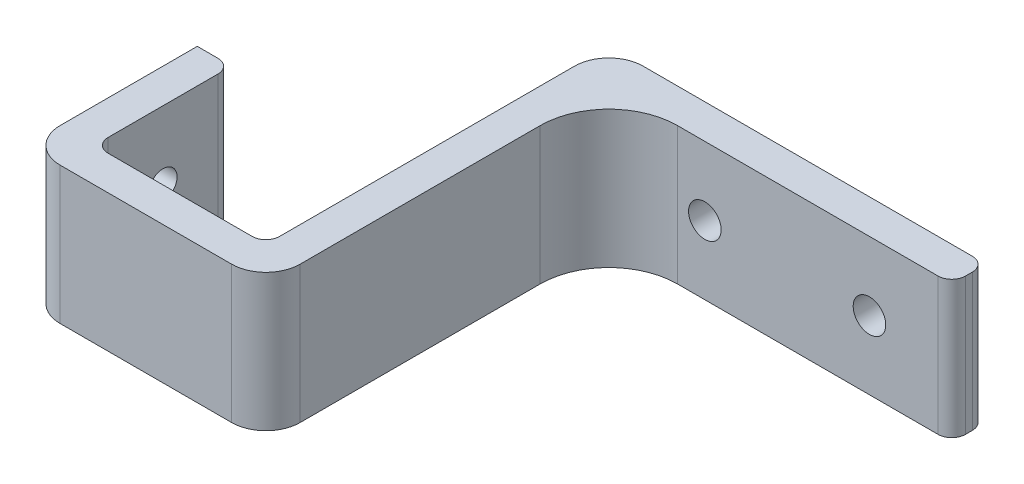
ISO-10303-21;
HEADER;
FILE_DESCRIPTION(('STEP AP214'),'2;1');
FILE_NAME('part.step','',(''),(''),'','','');
FILE_SCHEMA(('AUTOMOTIVE_DESIGN { 1 0 10303 214 1 1 1 1 }'));
ENDSEC;
DATA;
#1=APPLICATION_CONTEXT('core data for automotive mechanical design processes');
#2=APPLICATION_PROTOCOL_DEFINITION('international standard','automotive_design',2000,#1);
#3=PRODUCT_CONTEXT('',#1,'mechanical');
#4=PRODUCT('Part','Part','',(#3));
#5=PRODUCT_RELATED_PRODUCT_CATEGORY('part','',(#4));
#6=PRODUCT_DEFINITION_FORMATION('','',#4);
#7=PRODUCT_DEFINITION_CONTEXT('part definition',#1,'design');
#8=PRODUCT_DEFINITION('design','',#6,#7);
#9=PRODUCT_DEFINITION_SHAPE('','',#8);
#10=(LENGTH_UNIT() NAMED_UNIT(*) SI_UNIT(.MILLI.,.METRE.));
#11=(NAMED_UNIT(*) PLANE_ANGLE_UNIT() SI_UNIT($,.RADIAN.));
#12=(NAMED_UNIT(*) SI_UNIT($,.STERADIAN.) SOLID_ANGLE_UNIT());
#13=UNCERTAINTY_MEASURE_WITH_UNIT(LENGTH_MEASURE(1.E-05),#10,'distance_accuracy_value','');
#14=(GEOMETRIC_REPRESENTATION_CONTEXT(3) GLOBAL_UNCERTAINTY_ASSIGNED_CONTEXT((#13)) GLOBAL_UNIT_ASSIGNED_CONTEXT((#10,
#11,#12)) REPRESENTATION_CONTEXT('',''));
#15=CARTESIAN_POINT('',(0.,0.,0.));
#16=DIRECTION('',(0.,0.,1.));
#17=DIRECTION('',(1.,0.,0.));
#18=AXIS2_PLACEMENT_3D('',#15,#16,#17);
#19=CARTESIAN_POINT('',(0.,20.,20.));
#20=DIRECTION('',(-1.,0.,0.));
#21=DIRECTION('',(0.,0.,1.));
#22=AXIS2_PLACEMENT_3D('',#19,#20,#21);
#23=PLANE('',#22);
#24=CARTESIAN_POINT('',(0.,10.,10.));
#25=DIRECTION('',(1.,0.,0.));
#26=DIRECTION('',(0.,0.,-1.));
#27=AXIS2_PLACEMENT_3D('',#24,#25,#26);
#28=CIRCLE('',#27,2.05);
#29=CARTESIAN_POINT('',(0.,10.,7.95));
#30=VERTEX_POINT('',#29);
#31=EDGE_CURVE('E332',#30,#30,#28,.T.);
#32=ORIENTED_EDGE('',*,*,#31,.F.);
#33=EDGE_LOOP('',(#32));
#34=FACE_BOUND('',#33,.T.);
#35=DIRECTION('',(0.,0.,-1.));
#36=VECTOR('',#35,1.);
#37=CARTESIAN_POINT('',(0.,20.,20.));
#38=LINE('',#37,#36);
#39=CARTESIAN_POINT('',(0.,20.,18.));
#40=VERTEX_POINT('',#39);
#41=CARTESIAN_POINT('',(0.,20.,2.));
#42=VERTEX_POINT('',#41);
#43=EDGE_CURVE('E174',#40,#42,#38,.T.);
#44=ORIENTED_EDGE('',*,*,#43,.F.);
#45=DIRECTION('',(0.,-1.,0.));
#46=VECTOR('',#45,1.);
#47=CARTESIAN_POINT('',(0.,0.,18.));
#48=LINE('',#47,#46);
#49=CARTESIAN_POINT('',(0.,0.,18.));
#50=VERTEX_POINT('',#49);
#51=EDGE_CURVE('E274',#40,#50,#48,.T.);
#52=ORIENTED_EDGE('',*,*,#51,.T.);
#53=DIRECTION('',(0.,0.,-1.));
#54=VECTOR('',#53,1.);
#55=CARTESIAN_POINT('',(0.,0.,20.));
#56=LINE('',#55,#54);
#57=CARTESIAN_POINT('',(0.,0.,2.));
#58=VERTEX_POINT('',#57);
#59=EDGE_CURVE('E209',#50,#58,#56,.T.);
#60=ORIENTED_EDGE('',*,*,#59,.T.);
#61=DIRECTION('',(0.,-1.,0.));
#62=VECTOR('',#61,1.);
#63=CARTESIAN_POINT('',(0.,20.,2.));
#64=LINE('',#63,#62);
#65=EDGE_CURVE('E272',#58,#42,#64,.F.);
#66=ORIENTED_EDGE('',*,*,#65,.T.);
#67=EDGE_LOOP('',(#44,#52,#60,#66));
#68=FACE_BOUND('',#67,.T.);
#69=ADVANCED_FACE('F33',(#34,#68),#23,.F.);
#70=CARTESIAN_POINT('',(0.,20.,0.));
#71=DIRECTION('',(0.,0.,1.));
#72=DIRECTION('',(1.,0.,0.));
#73=AXIS2_PLACEMENT_3D('',#70,#71,#72);
#74=PLANE('',#73);
#75=DIRECTION('',(-1.,0.,0.));
#76=VECTOR('',#75,1.);
#77=CARTESIAN_POINT('',(0.,20.,0.));
#78=LINE('',#77,#76);
#79=CARTESIAN_POINT('',(-2.,20.,0.));
#80=VERTEX_POINT('',#79);
#81=CARTESIAN_POINT('',(-5.,20.,0.));
#82=VERTEX_POINT('',#81);
#83=EDGE_CURVE('E164',#80,#82,#78,.T.);
#84=ORIENTED_EDGE('',*,*,#83,.F.);
#85=DIRECTION('',(0.,-1.,0.));
#86=VECTOR('',#85,1.);
#87=CARTESIAN_POINT('',(-2.,20.,0.));
#88=LINE('',#87,#86);
#89=CARTESIAN_POINT('',(-2.,0.,0.));
#90=VERTEX_POINT('',#89);
#91=EDGE_CURVE('E303',#80,#90,#88,.T.);
#92=ORIENTED_EDGE('',*,*,#91,.T.);
#93=DIRECTION('',(-1.,0.,0.));
#94=VECTOR('',#93,1.);
#95=CARTESIAN_POINT('',(0.,0.,0.));
#96=LINE('',#95,#94);
#97=CARTESIAN_POINT('',(-5.,0.,0.));
#98=VERTEX_POINT('',#97);
#99=EDGE_CURVE('E180',#90,#98,#96,.T.);
#100=ORIENTED_EDGE('',*,*,#99,.T.);
#101=DIRECTION('',(0.,-1.,0.));
#102=VECTOR('',#101,1.);
#103=CARTESIAN_POINT('',(-5.,20.,0.));
#104=LINE('',#103,#102);
#105=EDGE_CURVE('E177',#82,#98,#104,.T.);
#106=ORIENTED_EDGE('',*,*,#105,.F.);
#107=EDGE_LOOP('',(#84,#92,#100,#106));
#108=FACE_BOUND('',#107,.T.);
#109=ADVANCED_FACE('F178',(#108),#74,.F.);
#110=CARTESIAN_POINT('',(-5.,20.,0.));
#111=DIRECTION('',(1.,0.,0.));
#112=DIRECTION('',(0.,0.,-1.));
#113=AXIS2_PLACEMENT_3D('',#110,#111,#112);
#114=PLANE('',#113);
#115=CARTESIAN_POINT('',(-5.,10.,10.));
#116=DIRECTION('',(1.,0.,0.));
#117=DIRECTION('',(0.,0.,-1.));
#118=AXIS2_PLACEMENT_3D('',#115,#116,#117);
#119=CIRCLE('',#118,2.05);
#120=CARTESIAN_POINT('',(-5.,10.,7.95));
#121=VERTEX_POINT('',#120);
#122=EDGE_CURVE('E212',#121,#121,#119,.T.);
#123=ORIENTED_EDGE('',*,*,#122,.T.);
#124=EDGE_LOOP('',(#123));
#125=FACE_BOUND('',#124,.T.);
#126=DIRECTION('',(0.,0.,1.));
#127=VECTOR('',#126,1.);
#128=CARTESIAN_POINT('',(-5.,0.,0.));
#129=LINE('',#128,#127);
#130=CARTESIAN_POINT('',(-5.,0.,20.));
#131=VERTEX_POINT('',#130);
#132=EDGE_CURVE('E214',#98,#131,#129,.T.);
#133=ORIENTED_EDGE('',*,*,#132,.T.);
#134=DIRECTION('',(0.,-1.,0.));
#135=VECTOR('',#134,1.);
#136=CARTESIAN_POINT('',(-5.,20.,20.));
#137=LINE('',#136,#135);
#138=CARTESIAN_POINT('',(-5.,20.,20.));
#139=VERTEX_POINT('',#138);
#140=EDGE_CURVE('E189',#131,#139,#137,.F.);
#141=ORIENTED_EDGE('',*,*,#140,.T.);
#142=DIRECTION('',(0.,0.,1.));
#143=VECTOR('',#142,1.);
#144=CARTESIAN_POINT('',(-5.,20.,0.));
#145=LINE('',#144,#143);
#146=EDGE_CURVE('E169',#82,#139,#145,.T.);
#147=ORIENTED_EDGE('',*,*,#146,.F.);
#148=ORIENTED_EDGE('',*,*,#105,.T.);
#149=EDGE_LOOP('',(#133,#141,#147,#148));
#150=FACE_BOUND('',#149,.T.);
#151=ADVANCED_FACE('F187',(#125,#150),#114,.F.);
#152=CARTESIAN_POINT('',(-5.,20.,25.));
#153=DIRECTION('',(0.,0.,-1.));
#154=DIRECTION('',(-1.,0.,0.));
#155=AXIS2_PLACEMENT_3D('',#152,#153,#154);
#156=PLANE('',#155);
#157=DIRECTION('',(1.,0.,0.));
#158=VECTOR('',#157,1.);
#159=CARTESIAN_POINT('',(-5.,20.,25.));
#160=LINE('',#159,#158);
#161=CARTESIAN_POINT('',(0.,20.,25.));
#162=VERTEX_POINT('',#161);
#163=CARTESIAN_POINT('',(25.,20.,25.));
#164=VERTEX_POINT('',#163);
#165=EDGE_CURVE('E190',#162,#164,#160,.T.);
#166=ORIENTED_EDGE('',*,*,#165,.F.);
#167=DIRECTION('',(0.,-1.,0.));
#168=VECTOR('',#167,1.);
#169=CARTESIAN_POINT('',(0.,20.,25.));
#170=LINE('',#169,#168);
#171=CARTESIAN_POINT('',(0.,0.,25.));
#172=VERTEX_POINT('',#171);
#173=EDGE_CURVE('E246',#162,#172,#170,.T.);
#174=ORIENTED_EDGE('',*,*,#173,.T.);
#175=DIRECTION('',(1.,0.,0.));
#176=VECTOR('',#175,1.);
#177=CARTESIAN_POINT('',(-5.,0.,25.));
#178=LINE('',#177,#176);
#179=CARTESIAN_POINT('',(25.,0.,25.));
#180=VERTEX_POINT('',#179);
#181=EDGE_CURVE('E216',#172,#180,#178,.T.);
#182=ORIENTED_EDGE('',*,*,#181,.T.);
#183=DIRECTION('',(0.,-1.,0.));
#184=VECTOR('',#183,1.);
#185=CARTESIAN_POINT('',(25.,20.,25.));
#186=LINE('',#185,#184);
#187=EDGE_CURVE('E244',#180,#164,#186,.F.);
#188=ORIENTED_EDGE('',*,*,#187,.T.);
#189=EDGE_LOOP('',(#166,#174,#182,#188));
#190=FACE_BOUND('',#189,.T.);
#191=ADVANCED_FACE('F397',(#190),#156,.F.);
#192=CARTESIAN_POINT('',(30.,20.,0.579896907216504));
#193=DIRECTION('',(-1.,0.,0.));
#194=DIRECTION('',(0.,0.,1.));
#195=AXIS2_PLACEMENT_3D('',#192,#193,#194);
#196=PLANE('',#195);
#197=DIRECTION('',(0.,0.,-1.));
#198=VECTOR('',#197,1.);
#199=CARTESIAN_POINT('',(30.,20.,25.));
#200=LINE('',#199,#198);
#201=CARTESIAN_POINT('',(30.,20.,20.));
#202=VERTEX_POINT('',#201);
#203=CARTESIAN_POINT('',(30.,20.,-15.));
#204=VERTEX_POINT('',#203);
#205=EDGE_CURVE('E193',#202,#204,#200,.T.);
#206=ORIENTED_EDGE('',*,*,#205,.F.);
#207=DIRECTION('',(0.,-1.,0.));
#208=VECTOR('',#207,1.);
#209=CARTESIAN_POINT('',(30.,20.,20.));
#210=LINE('',#209,#208);
#211=CARTESIAN_POINT('',(30.,0.,20.));
#212=VERTEX_POINT('',#211);
#213=EDGE_CURVE('E263',#202,#212,#210,.T.);
#214=ORIENTED_EDGE('',*,*,#213,.T.);
#215=DIRECTION('',(0.,0.,-1.));
#216=VECTOR('',#215,1.);
#217=CARTESIAN_POINT('',(30.,0.,0.579896907216504));
#218=LINE('',#217,#216);
#219=CARTESIAN_POINT('',(30.,0.,-15.));
#220=VERTEX_POINT('',#219);
#221=EDGE_CURVE('E219',#212,#220,#218,.T.);
#222=ORIENTED_EDGE('',*,*,#221,.T.);
#223=DIRECTION('',(0.,-1.,0.));
#224=VECTOR('',#223,1.);
#225=CARTESIAN_POINT('',(30.,20.,-15.));
#226=LINE('',#225,#224);
#227=EDGE_CURVE('E236',#220,#204,#226,.F.);
#228=ORIENTED_EDGE('',*,*,#227,.T.);
#229=EDGE_LOOP('',(#206,#214,#222,#228));
#230=FACE_BOUND('',#229,.T.);
#231=ADVANCED_FACE('F389',(#230),#196,.F.);
#232=CARTESIAN_POINT('',(80.,20.,-25.));
#233=DIRECTION('',(0.,0.,-1.));
#234=DIRECTION('',(-1.,0.,0.));
#235=AXIS2_PLACEMENT_3D('',#232,#233,#234);
#236=PLANE('',#235);
#237=CARTESIAN_POINT('',(68.,9.99999999999999,-25.));
#238=DIRECTION('',(0.,0.,-1.));
#239=DIRECTION('',(-1.,0.,0.));
#240=AXIS2_PLACEMENT_3D('',#237,#238,#239);
#241=CIRCLE('',#240,2.375);
#242=CARTESIAN_POINT('',(65.625,9.99999999999999,-25.));
#243=VERTEX_POINT('',#242);
#244=EDGE_CURVE('E343',#243,#243,#241,.T.);
#245=ORIENTED_EDGE('',*,*,#244,.T.);
#246=EDGE_LOOP('',(#245));
#247=FACE_BOUND('',#246,.T.);
#248=CARTESIAN_POINT('',(44.,9.99999999999999,-25.));
#249=DIRECTION('',(0.,0.,-1.));
#250=DIRECTION('',(-1.,0.,0.));
#251=AXIS2_PLACEMENT_3D('',#248,#249,#250);
#252=CIRCLE('',#251,2.375);
#253=CARTESIAN_POINT('',(41.625,9.99999999999999,-25.));
#254=VERTEX_POINT('',#253);
#255=EDGE_CURVE('E335',#254,#254,#252,.T.);
#256=ORIENTED_EDGE('',*,*,#255,.T.);
#257=EDGE_LOOP('',(#256));
#258=FACE_BOUND('',#257,.T.);
#259=DIRECTION('',(1.,0.,0.));
#260=VECTOR('',#259,1.);
#261=CARTESIAN_POINT('',(80.,0.,-25.));
#262=LINE('',#261,#260);
#263=CARTESIAN_POINT('',(40.,0.,-25.));
#264=VERTEX_POINT('',#263);
#265=CARTESIAN_POINT('',(78.,0.,-25.));
#266=VERTEX_POINT('',#265);
#267=EDGE_CURVE('E221',#264,#266,#262,.T.);
#268=ORIENTED_EDGE('',*,*,#267,.T.);
#269=DIRECTION('',(0.,-1.,0.));
#270=VECTOR('',#269,1.);
#271=CARTESIAN_POINT('',(78.,20.,-25.));
#272=LINE('',#271,#270);
#273=CARTESIAN_POINT('',(78.,20.,-25.));
#274=VERTEX_POINT('',#273);
#275=EDGE_CURVE('E301',#266,#274,#272,.F.);
#276=ORIENTED_EDGE('',*,*,#275,.T.);
#277=DIRECTION('',(1.,0.,0.));
#278=VECTOR('',#277,1.);
#279=CARTESIAN_POINT('',(80.,20.,-25.));
#280=LINE('',#279,#278);
#281=CARTESIAN_POINT('',(40.,20.,-25.));
#282=VERTEX_POINT('',#281);
#283=EDGE_CURVE('E198',#282,#274,#280,.T.);
#284=ORIENTED_EDGE('',*,*,#283,.F.);
#285=DIRECTION('',(0.,-1.,0.));
#286=VECTOR('',#285,1.);
#287=CARTESIAN_POINT('',(40.,0.,-25.));
#288=LINE('',#287,#286);
#289=EDGE_CURVE('E184',#282,#264,#288,.T.);
#290=ORIENTED_EDGE('',*,*,#289,.T.);
#291=EDGE_LOOP('',(#268,#276,#284,#290));
#292=FACE_BOUND('',#291,.T.);
#293=ADVANCED_FACE('F378',(#247,#258,#292),#236,.F.);
#294=CARTESIAN_POINT('',(80.,20.,-30.));
#295=DIRECTION('',(-1.,0.,0.));
#296=DIRECTION('',(0.,0.,1.));
#297=AXIS2_PLACEMENT_3D('',#294,#295,#296);
#298=PLANE('',#297);
#299=DIRECTION('',(0.,0.,-1.));
#300=VECTOR('',#299,1.);
#301=CARTESIAN_POINT('',(80.,0.,-30.));
#302=LINE('',#301,#300);
#303=CARTESIAN_POINT('',(80.,0.,-27.));
#304=VERTEX_POINT('',#303);
#305=CARTESIAN_POINT('',(80.,0.,-28.));
#306=VERTEX_POINT('',#305);
#307=EDGE_CURVE('E224',#304,#306,#302,.T.);
#308=ORIENTED_EDGE('',*,*,#307,.T.);
#309=DIRECTION('',(0.,-1.,0.));
#310=VECTOR('',#309,1.);
#311=CARTESIAN_POINT('',(80.,20.,-28.));
#312=LINE('',#311,#310);
#313=CARTESIAN_POINT('',(80.,20.,-28.));
#314=VERTEX_POINT('',#313);
#315=EDGE_CURVE('E294',#306,#314,#312,.F.);
#316=ORIENTED_EDGE('',*,*,#315,.T.);
#317=DIRECTION('',(0.,0.,-1.));
#318=VECTOR('',#317,1.);
#319=CARTESIAN_POINT('',(80.,20.,-30.));
#320=LINE('',#319,#318);
#321=CARTESIAN_POINT('',(80.,20.,-27.));
#322=VERTEX_POINT('',#321);
#323=EDGE_CURVE('E201',#322,#314,#320,.T.);
#324=ORIENTED_EDGE('',*,*,#323,.F.);
#325=DIRECTION('',(0.,-1.,0.));
#326=VECTOR('',#325,1.);
#327=CARTESIAN_POINT('',(80.,20.,-27.));
#328=LINE('',#327,#326);
#329=EDGE_CURVE('E291',#322,#304,#328,.T.);
#330=ORIENTED_EDGE('',*,*,#329,.T.);
#331=EDGE_LOOP('',(#308,#316,#324,#330));
#332=FACE_BOUND('',#331,.T.);
#333=ADVANCED_FACE('F356',(#332),#298,.F.);
#334=CARTESIAN_POINT('',(25.,20.,-30.));
#335=DIRECTION('',(0.,0.,1.));
#336=DIRECTION('',(1.,0.,0.));
#337=AXIS2_PLACEMENT_3D('',#334,#335,#336);
#338=PLANE('',#337);
#339=CARTESIAN_POINT('',(68.,9.99999999999999,-30.));
#340=DIRECTION('',(0.,0.,-1.));
#341=DIRECTION('',(-1.,0.,0.));
#342=AXIS2_PLACEMENT_3D('',#339,#340,#341);
#343=CIRCLE('',#342,2.375);
#344=CARTESIAN_POINT('',(65.625,9.99999999999999,-30.));
#345=VERTEX_POINT('',#344);
#346=EDGE_CURVE('E346',#345,#345,#343,.T.);
#347=ORIENTED_EDGE('',*,*,#346,.F.);
#348=EDGE_LOOP('',(#347));
#349=FACE_BOUND('',#348,.T.);
#350=CARTESIAN_POINT('',(44.,9.99999999999999,-30.));
#351=DIRECTION('',(0.,0.,-1.));
#352=DIRECTION('',(-1.,0.,0.));
#353=AXIS2_PLACEMENT_3D('',#350,#351,#352);
#354=CIRCLE('',#353,2.375);
#355=CARTESIAN_POINT('',(41.625,9.99999999999999,-30.));
#356=VERTEX_POINT('',#355);
#357=EDGE_CURVE('E340',#356,#356,#354,.T.);
#358=ORIENTED_EDGE('',*,*,#357,.F.);
#359=EDGE_LOOP('',(#358));
#360=FACE_BOUND('',#359,.T.);
#361=DIRECTION('',(-1.,0.,0.));
#362=VECTOR('',#361,1.);
#363=CARTESIAN_POINT('',(25.,20.,-30.));
#364=LINE('',#363,#362);
#365=CARTESIAN_POINT('',(78.,20.,-30.));
#366=VERTEX_POINT('',#365);
#367=CARTESIAN_POINT('',(30.,20.,-30.));
#368=VERTEX_POINT('',#367);
#369=EDGE_CURVE('E203',#366,#368,#364,.T.);
#370=ORIENTED_EDGE('',*,*,#369,.F.);
#371=DIRECTION('',(0.,-1.,0.));
#372=VECTOR('',#371,1.);
#373=CARTESIAN_POINT('',(78.,20.,-30.));
#374=LINE('',#373,#372);
#375=CARTESIAN_POINT('',(78.,0.,-30.));
#376=VERTEX_POINT('',#375);
#377=EDGE_CURVE('E282',#366,#376,#374,.T.);
#378=ORIENTED_EDGE('',*,*,#377,.T.);
#379=DIRECTION('',(-1.,0.,0.));
#380=VECTOR('',#379,1.);
#381=CARTESIAN_POINT('',(25.,0.,-30.));
#382=LINE('',#381,#380);
#383=CARTESIAN_POINT('',(30.,0.,-30.));
#384=VERTEX_POINT('',#383);
#385=EDGE_CURVE('E227',#376,#384,#382,.T.);
#386=ORIENTED_EDGE('',*,*,#385,.T.);
#387=DIRECTION('',(0.,-1.,0.));
#388=VECTOR('',#387,1.);
#389=CARTESIAN_POINT('',(30.,20.,-30.));
#390=LINE('',#389,#388);
#391=EDGE_CURVE('E269',#384,#368,#390,.F.);
#392=ORIENTED_EDGE('',*,*,#391,.T.);
#393=EDGE_LOOP('',(#370,#378,#386,#392));
#394=FACE_BOUND('',#393,.T.);
#395=ADVANCED_FACE('F353',(#349,#360,#394),#338,.F.);
#396=CARTESIAN_POINT('',(25.,20.,-30.));
#397=DIRECTION('',(1.,0.,0.));
#398=DIRECTION('',(0.,0.,-1.));
#399=AXIS2_PLACEMENT_3D('',#396,#397,#398);
#400=PLANE('',#399);
#401=DIRECTION('',(0.,0.,1.));
#402=VECTOR('',#401,1.);
#403=CARTESIAN_POINT('',(25.,0.,-30.));
#404=LINE('',#403,#402);
#405=CARTESIAN_POINT('',(25.,0.,-25.));
#406=VERTEX_POINT('',#405);
#407=CARTESIAN_POINT('',(25.,0.,18.));
#408=VERTEX_POINT('',#407);
#409=EDGE_CURVE('E229',#406,#408,#404,.T.);
#410=ORIENTED_EDGE('',*,*,#409,.T.);
#411=DIRECTION('',(0.,-1.,0.));
#412=VECTOR('',#411,1.);
#413=CARTESIAN_POINT('',(25.,20.,18.));
#414=LINE('',#413,#412);
#415=CARTESIAN_POINT('',(25.,20.,18.));
#416=VERTEX_POINT('',#415);
#417=EDGE_CURVE('E56',#408,#416,#414,.F.);
#418=ORIENTED_EDGE('',*,*,#417,.T.);
#419=DIRECTION('',(0.,0.,1.));
#420=VECTOR('',#419,1.);
#421=CARTESIAN_POINT('',(25.,20.,-30.));
#422=LINE('',#421,#420);
#423=CARTESIAN_POINT('',(25.,20.,-25.));
#424=VERTEX_POINT('',#423);
#425=EDGE_CURVE('E205',#424,#416,#422,.T.);
#426=ORIENTED_EDGE('',*,*,#425,.F.);
#427=DIRECTION('',(0.,-1.,0.));
#428=VECTOR('',#427,1.);
#429=CARTESIAN_POINT('',(25.,20.,-25.));
#430=LINE('',#429,#428);
#431=EDGE_CURVE('E266',#424,#406,#430,.T.);
#432=ORIENTED_EDGE('',*,*,#431,.T.);
#433=EDGE_LOOP('',(#410,#418,#426,#432));
#434=FACE_BOUND('',#433,.T.);
#435=ADVANCED_FACE('F316',(#434),#400,.F.);
#436=CARTESIAN_POINT('',(25.,20.,20.));
#437=DIRECTION('',(0.,0.,1.));
#438=DIRECTION('',(1.,0.,0.));
#439=AXIS2_PLACEMENT_3D('',#436,#437,#438);
#440=PLANE('',#439);
#441=DIRECTION('',(-1.,0.,0.));
#442=VECTOR('',#441,1.);
#443=CARTESIAN_POINT('',(25.,0.,20.));
#444=LINE('',#443,#442);
#445=CARTESIAN_POINT('',(23.,0.,20.));
#446=VERTEX_POINT('',#445);
#447=CARTESIAN_POINT('',(2.,0.,20.));
#448=VERTEX_POINT('',#447);
#449=EDGE_CURVE('E231',#446,#448,#444,.T.);
#450=ORIENTED_EDGE('',*,*,#449,.T.);
#451=DIRECTION('',(0.,-1.,0.));
#452=VECTOR('',#451,1.);
#453=CARTESIAN_POINT('',(2.,20.,20.));
#454=LINE('',#453,#452);
#455=CARTESIAN_POINT('',(2.,20.,20.));
#456=VERTEX_POINT('',#455);
#457=EDGE_CURVE('E280',#448,#456,#454,.F.);
#458=ORIENTED_EDGE('',*,*,#457,.T.);
#459=DIRECTION('',(-1.,0.,0.));
#460=VECTOR('',#459,1.);
#461=CARTESIAN_POINT('',(25.,20.,20.));
#462=LINE('',#461,#460);
#463=CARTESIAN_POINT('',(23.,20.,20.));
#464=VERTEX_POINT('',#463);
#465=EDGE_CURVE('E185',#464,#456,#462,.T.);
#466=ORIENTED_EDGE('',*,*,#465,.F.);
#467=DIRECTION('',(0.,-1.,0.));
#468=VECTOR('',#467,1.);
#469=CARTESIAN_POINT('',(23.,0.,20.));
#470=LINE('',#469,#468);
#471=EDGE_CURVE('E277',#464,#446,#470,.T.);
#472=ORIENTED_EDGE('',*,*,#471,.T.);
#473=EDGE_LOOP('',(#450,#458,#466,#472));
#474=FACE_BOUND('',#473,.T.);
#475=ADVANCED_FACE('F322',(#474),#440,.F.);
#476=CARTESIAN_POINT('',(0.,20.,0.));
#477=DIRECTION('',(0.,1.,0.));
#478=DIRECTION('',(0.,0.,1.));
#479=AXIS2_PLACEMENT_3D('',#476,#477,#478);
#480=PLANE('',#479);
#481=ORIENTED_EDGE('',*,*,#323,.T.);
#482=CARTESIAN_POINT('',(78.,20.,-28.));
#483=DIRECTION('',(0.,1.,0.));
#484=DIRECTION('',(0.,0.,1.));
#485=AXIS2_PLACEMENT_3D('',#482,#483,#484);
#486=CIRCLE('',#485,2.);
#487=EDGE_CURVE('E299',#314,#366,#486,.T.);
#488=ORIENTED_EDGE('',*,*,#487,.T.);
#489=ORIENTED_EDGE('',*,*,#369,.T.);
#490=CARTESIAN_POINT('',(30.,20.,-25.));
#491=DIRECTION('',(0.,1.,0.));
#492=DIRECTION('',(0.,0.,1.));
#493=AXIS2_PLACEMENT_3D('',#490,#491,#492);
#494=CIRCLE('',#493,5.);
#495=EDGE_CURVE('E257',#368,#424,#494,.T.);
#496=ORIENTED_EDGE('',*,*,#495,.T.);
#497=ORIENTED_EDGE('',*,*,#425,.T.);
#498=CARTESIAN_POINT('',(23.,20.,18.));
#499=DIRECTION('',(0.,1.,0.));
#500=DIRECTION('',(0.,0.,1.));
#501=AXIS2_PLACEMENT_3D('',#498,#499,#500);
#502=CIRCLE('',#501,2.);
#503=EDGE_CURVE('E11',#416,#464,#502,.F.);
#504=ORIENTED_EDGE('',*,*,#503,.T.);
#505=ORIENTED_EDGE('',*,*,#465,.T.);
#506=CARTESIAN_POINT('',(2.,20.,18.));
#507=DIRECTION('',(0.,1.,0.));
#508=DIRECTION('',(0.,0.,1.));
#509=AXIS2_PLACEMENT_3D('',#506,#507,#508);
#510=CIRCLE('',#509,2.);
#511=EDGE_CURVE('E308',#456,#40,#510,.F.);
#512=ORIENTED_EDGE('',*,*,#511,.T.);
#513=ORIENTED_EDGE('',*,*,#43,.T.);
#514=CARTESIAN_POINT('',(-2.,20.,2.));
#515=DIRECTION('',(0.,1.,0.));
#516=DIRECTION('',(0.,0.,1.));
#517=AXIS2_PLACEMENT_3D('',#514,#515,#516);
#518=CIRCLE('',#517,2.);
#519=EDGE_CURVE('E48',#42,#80,#518,.T.);
#520=ORIENTED_EDGE('',*,*,#519,.T.);
#521=ORIENTED_EDGE('',*,*,#83,.T.);
#522=ORIENTED_EDGE('',*,*,#146,.T.);
#523=CARTESIAN_POINT('',(0.,20.,20.));
#524=DIRECTION('',(0.,1.,0.));
#525=DIRECTION('',(0.,0.,1.));
#526=AXIS2_PLACEMENT_3D('',#523,#524,#525);
#527=CIRCLE('',#526,5.);
#528=EDGE_CURVE('E261',#139,#162,#527,.T.);
#529=ORIENTED_EDGE('',*,*,#528,.T.);
#530=ORIENTED_EDGE('',*,*,#165,.T.);
#531=CARTESIAN_POINT('',(25.,20.,20.));
#532=DIRECTION('',(0.,1.,0.));
#533=DIRECTION('',(0.,0.,1.));
#534=AXIS2_PLACEMENT_3D('',#531,#532,#533);
#535=CIRCLE('',#534,5.);
#536=EDGE_CURVE('E259',#164,#202,#535,.T.);
#537=ORIENTED_EDGE('',*,*,#536,.T.);
#538=ORIENTED_EDGE('',*,*,#205,.T.);
#539=CARTESIAN_POINT('',(40.,20.,-15.));
#540=DIRECTION('',(0.,1.,0.));
#541=DIRECTION('',(0.,0.,1.));
#542=AXIS2_PLACEMENT_3D('',#539,#540,#541);
#543=CIRCLE('',#542,10.);
#544=EDGE_CURVE('E242',#204,#282,#543,.F.);
#545=ORIENTED_EDGE('',*,*,#544,.T.);
#546=ORIENTED_EDGE('',*,*,#283,.T.);
#547=CARTESIAN_POINT('',(78.,20.,-27.));
#548=DIRECTION('',(0.,1.,0.));
#549=DIRECTION('',(0.,0.,1.));
#550=AXIS2_PLACEMENT_3D('',#547,#548,#549);
#551=CIRCLE('',#550,2.);
#552=EDGE_CURVE('E297',#274,#322,#551,.T.);
#553=ORIENTED_EDGE('',*,*,#552,.T.);
#554=EDGE_LOOP('',(#481,#488,#489,#496,#497,#504,#505,#512,#513,#520,#521,#522,#529,#530,#537,
#538,#545,#546,#553));
#555=FACE_BOUND('',#554,.T.);
#556=ADVANCED_FACE('F167',(#555),#480,.T.);
#557=CARTESIAN_POINT('',(0.,0.,0.));
#558=DIRECTION('',(0.,1.,0.));
#559=DIRECTION('',(0.,0.,1.));
#560=AXIS2_PLACEMENT_3D('',#557,#558,#559);
#561=PLANE('',#560);
#562=ORIENTED_EDGE('',*,*,#385,.F.);
#563=CARTESIAN_POINT('',(78.,0.,-28.));
#564=DIRECTION('',(0.,1.,0.));
#565=DIRECTION('',(0.,0.,1.));
#566=AXIS2_PLACEMENT_3D('',#563,#564,#565);
#567=CIRCLE('',#566,2.);
#568=EDGE_CURVE('E289',#376,#306,#567,.F.);
#569=ORIENTED_EDGE('',*,*,#568,.T.);
#570=ORIENTED_EDGE('',*,*,#307,.F.);
#571=CARTESIAN_POINT('',(78.,0.,-27.));
#572=DIRECTION('',(0.,1.,0.));
#573=DIRECTION('',(0.,0.,1.));
#574=AXIS2_PLACEMENT_3D('',#571,#572,#573);
#575=CIRCLE('',#574,2.);
#576=EDGE_CURVE('E287',#304,#266,#575,.F.);
#577=ORIENTED_EDGE('',*,*,#576,.T.);
#578=ORIENTED_EDGE('',*,*,#267,.F.);
#579=CARTESIAN_POINT('',(40.,0.,-15.));
#580=DIRECTION('',(0.,1.,0.));
#581=DIRECTION('',(0.,0.,1.));
#582=AXIS2_PLACEMENT_3D('',#579,#580,#581);
#583=CIRCLE('',#582,10.);
#584=EDGE_CURVE('E239',#264,#220,#583,.T.);
#585=ORIENTED_EDGE('',*,*,#584,.T.);
#586=ORIENTED_EDGE('',*,*,#221,.F.);
#587=CARTESIAN_POINT('',(25.,0.,20.));
#588=DIRECTION('',(0.,1.,0.));
#589=DIRECTION('',(0.,0.,1.));
#590=AXIS2_PLACEMENT_3D('',#587,#588,#589);
#591=CIRCLE('',#590,5.);
#592=EDGE_CURVE('E252',#212,#180,#591,.F.);
#593=ORIENTED_EDGE('',*,*,#592,.T.);
#594=ORIENTED_EDGE('',*,*,#181,.F.);
#595=CARTESIAN_POINT('',(0.,0.,20.));
#596=DIRECTION('',(0.,1.,0.));
#597=DIRECTION('',(0.,0.,1.));
#598=AXIS2_PLACEMENT_3D('',#595,#596,#597);
#599=CIRCLE('',#598,5.);
#600=EDGE_CURVE('E254',#172,#131,#599,.F.);
#601=ORIENTED_EDGE('',*,*,#600,.T.);
#602=ORIENTED_EDGE('',*,*,#132,.F.);
#603=ORIENTED_EDGE('',*,*,#99,.F.);
#604=CARTESIAN_POINT('',(-2.,0.,2.));
#605=DIRECTION('',(0.,1.,0.));
#606=DIRECTION('',(0.,0.,1.));
#607=AXIS2_PLACEMENT_3D('',#604,#605,#606);
#608=CIRCLE('',#607,2.);
#609=EDGE_CURVE('E285',#90,#58,#608,.F.);
#610=ORIENTED_EDGE('',*,*,#609,.T.);
#611=ORIENTED_EDGE('',*,*,#59,.F.);
#612=CARTESIAN_POINT('',(2.,0.,18.));
#613=DIRECTION('',(0.,1.,0.));
#614=DIRECTION('',(0.,0.,1.));
#615=AXIS2_PLACEMENT_3D('',#612,#613,#614);
#616=CIRCLE('',#615,2.);
#617=EDGE_CURVE('E306',#50,#448,#616,.T.);
#618=ORIENTED_EDGE('',*,*,#617,.T.);
#619=ORIENTED_EDGE('',*,*,#449,.F.);
#620=CARTESIAN_POINT('',(23.,0.,18.));
#621=DIRECTION('',(0.,1.,0.));
#622=DIRECTION('',(0.,0.,1.));
#623=AXIS2_PLACEMENT_3D('',#620,#621,#622);
#624=CIRCLE('',#623,2.);
#625=EDGE_CURVE('E41',#446,#408,#624,.T.);
#626=ORIENTED_EDGE('',*,*,#625,.T.);
#627=ORIENTED_EDGE('',*,*,#409,.F.);
#628=CARTESIAN_POINT('',(30.,0.,-25.));
#629=DIRECTION('',(0.,1.,0.));
#630=DIRECTION('',(0.,0.,1.));
#631=AXIS2_PLACEMENT_3D('',#628,#629,#630);
#632=CIRCLE('',#631,5.);
#633=EDGE_CURVE('E249',#406,#384,#632,.F.);
#634=ORIENTED_EDGE('',*,*,#633,.T.);
#635=EDGE_LOOP('',(#562,#569,#570,#577,#578,#585,#586,#593,#594,#601,#602,#603,#610,#611,#618,
#619,#626,#627,#634));
#636=FACE_BOUND('',#635,.T.);
#637=ADVANCED_FACE('F313',(#636),#561,.F.);
#638=CARTESIAN_POINT('',(-5.,10.,10.));
#639=DIRECTION('',(1.,0.,0.));
#640=DIRECTION('',(0.,0.,-1.));
#641=AXIS2_PLACEMENT_3D('',#638,#639,#640);
#642=CYLINDRICAL_SURFACE('',#641,2.05);
#643=ORIENTED_EDGE('',*,*,#122,.F.);
#644=EDGE_LOOP('',(#643));
#645=FACE_BOUND('',#644,.T.);
#646=ORIENTED_EDGE('',*,*,#31,.T.);
#647=EDGE_LOOP('',(#646));
#648=FACE_BOUND('',#647,.T.);
#649=ADVANCED_FACE('F497',(#645,#648),#642,.F.);
#650=CARTESIAN_POINT('',(44.,9.99999999999999,25.));
#651=DIRECTION('',(0.,0.,-1.));
#652=DIRECTION('',(-1.,0.,0.));
#653=AXIS2_PLACEMENT_3D('',#650,#651,#652);
#654=CYLINDRICAL_SURFACE('',#653,2.375);
#655=ORIENTED_EDGE('',*,*,#357,.T.);
#656=EDGE_LOOP('',(#655));
#657=FACE_BOUND('',#656,.T.);
#658=ORIENTED_EDGE('',*,*,#255,.F.);
#659=EDGE_LOOP('',(#658));
#660=FACE_BOUND('',#659,.T.);
#661=ADVANCED_FACE('F489',(#657,#660),#654,.F.);
#662=CARTESIAN_POINT('',(68.,9.99999999999999,25.));
#663=DIRECTION('',(0.,0.,-1.));
#664=DIRECTION('',(-1.,0.,0.));
#665=AXIS2_PLACEMENT_3D('',#662,#663,#664);
#666=CYLINDRICAL_SURFACE('',#665,2.375);
#667=ORIENTED_EDGE('',*,*,#346,.T.);
#668=EDGE_LOOP('',(#667));
#669=FACE_BOUND('',#668,.T.);
#670=ORIENTED_EDGE('',*,*,#244,.F.);
#671=EDGE_LOOP('',(#670));
#672=FACE_BOUND('',#671,.T.);
#673=ADVANCED_FACE('F350',(#669,#672),#666,.F.);
#674=CARTESIAN_POINT('',(40.,20.,-15.));
#675=DIRECTION('',(0.,1.,0.));
#676=DIRECTION('',(0.,0.,1.));
#677=AXIS2_PLACEMENT_3D('',#674,#675,#676);
#678=CYLINDRICAL_SURFACE('',#677,10.);
#679=ORIENTED_EDGE('',*,*,#544,.F.);
#680=ORIENTED_EDGE('',*,*,#227,.F.);
#681=ORIENTED_EDGE('',*,*,#584,.F.);
#682=ORIENTED_EDGE('',*,*,#289,.F.);
#683=EDGE_LOOP('',(#679,#680,#681,#682));
#684=FACE_BOUND('',#683,.T.);
#685=ADVANCED_FACE('F383',(#684),#678,.F.);
#686=CARTESIAN_POINT('',(0.,20.,20.));
#687=DIRECTION('',(0.,-1.,0.));
#688=DIRECTION('',(0.,0.,-1.));
#689=AXIS2_PLACEMENT_3D('',#686,#687,#688);
#690=CYLINDRICAL_SURFACE('',#689,5.);
#691=ORIENTED_EDGE('',*,*,#528,.F.);
#692=ORIENTED_EDGE('',*,*,#140,.F.);
#693=ORIENTED_EDGE('',*,*,#600,.F.);
#694=ORIENTED_EDGE('',*,*,#173,.F.);
#695=EDGE_LOOP('',(#691,#692,#693,#694));
#696=FACE_BOUND('',#695,.T.);
#697=ADVANCED_FACE('F400',(#696),#690,.T.);
#698=CARTESIAN_POINT('',(25.,20.,20.));
#699=DIRECTION('',(0.,-1.,0.));
#700=DIRECTION('',(0.,0.,-1.));
#701=AXIS2_PLACEMENT_3D('',#698,#699,#700);
#702=CYLINDRICAL_SURFACE('',#701,5.);
#703=ORIENTED_EDGE('',*,*,#536,.F.);
#704=ORIENTED_EDGE('',*,*,#187,.F.);
#705=ORIENTED_EDGE('',*,*,#592,.F.);
#706=ORIENTED_EDGE('',*,*,#213,.F.);
#707=EDGE_LOOP('',(#703,#704,#705,#706));
#708=FACE_BOUND('',#707,.T.);
#709=ADVANCED_FACE('F393',(#708),#702,.T.);
#710=CARTESIAN_POINT('',(30.,20.,-25.));
#711=DIRECTION('',(0.,-1.,0.));
#712=DIRECTION('',(0.,0.,-1.));
#713=AXIS2_PLACEMENT_3D('',#710,#711,#712);
#714=CYLINDRICAL_SURFACE('',#713,5.);
#715=ORIENTED_EDGE('',*,*,#495,.F.);
#716=ORIENTED_EDGE('',*,*,#391,.F.);
#717=ORIENTED_EDGE('',*,*,#633,.F.);
#718=ORIENTED_EDGE('',*,*,#431,.F.);
#719=EDGE_LOOP('',(#715,#716,#717,#718));
#720=FACE_BOUND('',#719,.T.);
#721=ADVANCED_FACE('F425',(#720),#714,.T.);
#722=CARTESIAN_POINT('',(2.,20.,18.));
#723=DIRECTION('',(0.,1.,0.));
#724=DIRECTION('',(0.,0.,1.));
#725=AXIS2_PLACEMENT_3D('',#722,#723,#724);
#726=CYLINDRICAL_SURFACE('',#725,2.);
#727=ORIENTED_EDGE('',*,*,#511,.F.);
#728=ORIENTED_EDGE('',*,*,#457,.F.);
#729=ORIENTED_EDGE('',*,*,#617,.F.);
#730=ORIENTED_EDGE('',*,*,#51,.F.);
#731=EDGE_LOOP('',(#727,#728,#729,#730));
#732=FACE_BOUND('',#731,.T.);
#733=ADVANCED_FACE('F325',(#732),#726,.F.);
#734=CARTESIAN_POINT('',(78.,20.,-28.));
#735=DIRECTION('',(0.,-1.,0.));
#736=DIRECTION('',(0.,0.,-1.));
#737=AXIS2_PLACEMENT_3D('',#734,#735,#736);
#738=CYLINDRICAL_SURFACE('',#737,2.);
#739=ORIENTED_EDGE('',*,*,#487,.F.);
#740=ORIENTED_EDGE('',*,*,#315,.F.);
#741=ORIENTED_EDGE('',*,*,#568,.F.);
#742=ORIENTED_EDGE('',*,*,#377,.F.);
#743=EDGE_LOOP('',(#739,#740,#741,#742));
#744=FACE_BOUND('',#743,.T.);
#745=ADVANCED_FACE('F366',(#744),#738,.T.);
#746=CARTESIAN_POINT('',(78.,20.,-27.));
#747=DIRECTION('',(0.,-1.,0.));
#748=DIRECTION('',(0.,0.,-1.));
#749=AXIS2_PLACEMENT_3D('',#746,#747,#748);
#750=CYLINDRICAL_SURFACE('',#749,2.);
#751=ORIENTED_EDGE('',*,*,#552,.F.);
#752=ORIENTED_EDGE('',*,*,#275,.F.);
#753=ORIENTED_EDGE('',*,*,#576,.F.);
#754=ORIENTED_EDGE('',*,*,#329,.F.);
#755=EDGE_LOOP('',(#751,#752,#753,#754));
#756=FACE_BOUND('',#755,.T.);
#757=ADVANCED_FACE('F374',(#756),#750,.T.);
#758=CARTESIAN_POINT('',(-2.,20.,2.));
#759=DIRECTION('',(0.,-1.,0.));
#760=DIRECTION('',(0.,0.,-1.));
#761=AXIS2_PLACEMENT_3D('',#758,#759,#760);
#762=CYLINDRICAL_SURFACE('',#761,2.);
#763=ORIENTED_EDGE('',*,*,#519,.F.);
#764=ORIENTED_EDGE('',*,*,#65,.F.);
#765=ORIENTED_EDGE('',*,*,#609,.F.);
#766=ORIENTED_EDGE('',*,*,#91,.F.);
#767=EDGE_LOOP('',(#763,#764,#765,#766));
#768=FACE_BOUND('',#767,.T.);
#769=ADVANCED_FACE('F402',(#768),#762,.T.);
#770=CARTESIAN_POINT('',(23.,20.,18.));
#771=DIRECTION('',(0.,1.,0.));
#772=DIRECTION('',(0.,0.,1.));
#773=AXIS2_PLACEMENT_3D('',#770,#771,#772);
#774=CYLINDRICAL_SURFACE('',#773,2.);
#775=ORIENTED_EDGE('',*,*,#503,.F.);
#776=ORIENTED_EDGE('',*,*,#417,.F.);
#777=ORIENTED_EDGE('',*,*,#625,.F.);
#778=ORIENTED_EDGE('',*,*,#471,.F.);
#779=EDGE_LOOP('',(#775,#776,#777,#778));
#780=FACE_BOUND('',#779,.T.);
#781=ADVANCED_FACE('F35',(#780),#774,.F.);
#782=CLOSED_SHELL('',(#69,#109,#151,#191,#231,#293,#333,#395,#435,#475,#556,#637,#649,#661,#673,
#685,#697,#709,#721,#733,#745,#757,#769,#781));
#783=MANIFOLD_SOLID_BREP('B2',#782);
#784=ADVANCED_BREP_SHAPE_REPRESENTATION('',(#18,#783),#14);
#785=SHAPE_DEFINITION_REPRESENTATION(#9,#784);
ENDSEC;
END-ISO-10303-21;
